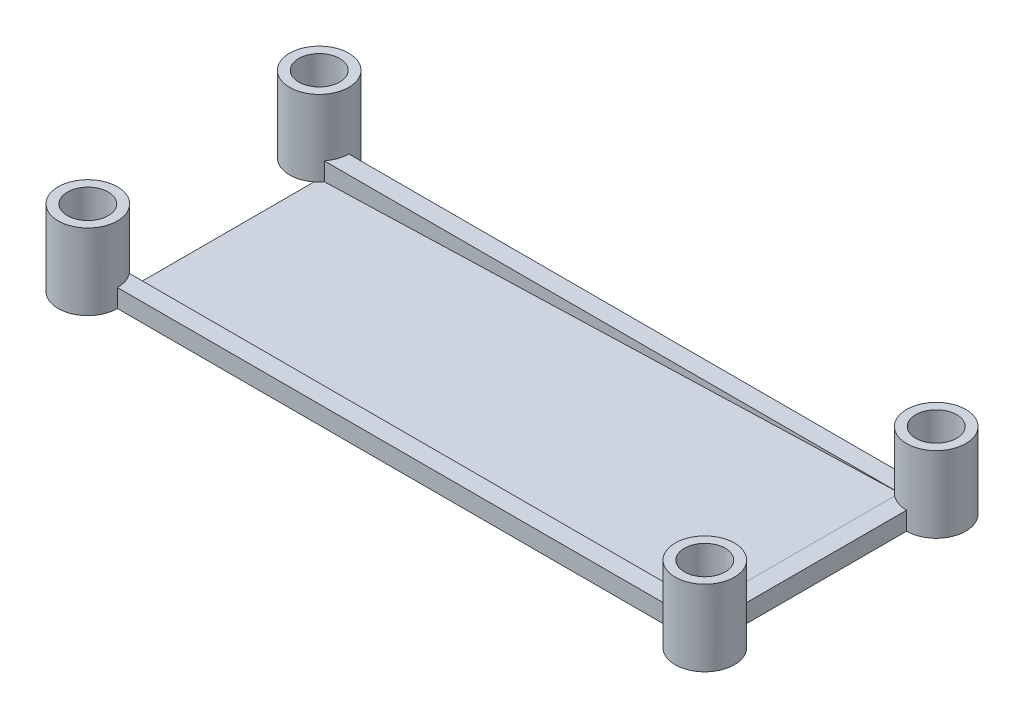
ISO-10303-21;
HEADER;
FILE_DESCRIPTION(('STEP AP214'),'2;1');
FILE_NAME('part.step','',(''),(''),'','','');
FILE_SCHEMA(('AUTOMOTIVE_DESIGN { 1 0 10303 214 1 1 1 1 }'));
ENDSEC;
DATA;
#1=APPLICATION_CONTEXT('core data for automotive mechanical design processes');
#2=APPLICATION_PROTOCOL_DEFINITION('international standard','automotive_design',2000,#1);
#3=PRODUCT_CONTEXT('',#1,'mechanical');
#4=PRODUCT('Part','Part','',(#3));
#5=PRODUCT_RELATED_PRODUCT_CATEGORY('part','',(#4));
#6=PRODUCT_DEFINITION_FORMATION('','',#4);
#7=PRODUCT_DEFINITION_CONTEXT('part definition',#1,'design');
#8=PRODUCT_DEFINITION('design','',#6,#7);
#9=PRODUCT_DEFINITION_SHAPE('','',#8);
#10=(LENGTH_UNIT() NAMED_UNIT(*) SI_UNIT(.MILLI.,.METRE.));
#11=(NAMED_UNIT(*) PLANE_ANGLE_UNIT() SI_UNIT($,.RADIAN.));
#12=(NAMED_UNIT(*) SI_UNIT($,.STERADIAN.) SOLID_ANGLE_UNIT());
#13=UNCERTAINTY_MEASURE_WITH_UNIT(LENGTH_MEASURE(1.E-05),#10,'distance_accuracy_value','');
#14=(GEOMETRIC_REPRESENTATION_CONTEXT(3) GLOBAL_UNCERTAINTY_ASSIGNED_CONTEXT((#13)) GLOBAL_UNIT_ASSIGNED_CONTEXT((#10,
#11,#12)) REPRESENTATION_CONTEXT('',''));
#15=CARTESIAN_POINT('',(0.,0.,0.));
#16=DIRECTION('',(0.,0.,1.));
#17=DIRECTION('',(1.,0.,0.));
#18=AXIS2_PLACEMENT_3D('',#15,#16,#17);
#19=CARTESIAN_POINT('',(0.,0.,0.));
#20=DIRECTION('',(0.,-1.,0.));
#21=DIRECTION('',(0.,0.,-1.));
#22=AXIS2_PLACEMENT_3D('',#19,#20,#21);
#23=PLANE('',#22);
#24=DIRECTION('',(-1.,0.,0.));
#25=VECTOR('',#24,1.);
#26=CARTESIAN_POINT('',(-203.2,0.,-76.2));
#27=LINE('',#26,#25);
#28=CARTESIAN_POINT('',(183.70625,0.,-76.2));
#29=VERTEX_POINT('',#28);
#30=CARTESIAN_POINT('',(-183.70625,0.,-76.2));
#31=VERTEX_POINT('',#30);
#32=EDGE_CURVE('E188',#29,#31,#27,.T.);
#33=ORIENTED_EDGE('',*,*,#32,.F.);
#34=CARTESIAN_POINT('',(203.2,0.,-76.2));
#35=DIRECTION('',(0.,1.,0.));
#36=DIRECTION('',(0.,0.,-1.));
#37=AXIS2_PLACEMENT_3D('',#34,#35,#36);
#38=CIRCLE('',#37,19.49375);
#39=CARTESIAN_POINT('',(203.2,0.,-56.7062499999999));
#40=VERTEX_POINT('',#39);
#41=EDGE_CURVE('E297',#40,#29,#38,.T.);
#42=ORIENTED_EDGE('',*,*,#41,.F.);
#43=DIRECTION('',(0.,0.,-1.));
#44=VECTOR('',#43,1.);
#45=CARTESIAN_POINT('',(203.2,0.,76.2));
#46=LINE('',#45,#44);
#47=CARTESIAN_POINT('',(203.2,0.,56.70625));
#48=VERTEX_POINT('',#47);
#49=EDGE_CURVE('E61',#48,#40,#46,.T.);
#50=ORIENTED_EDGE('',*,*,#49,.F.);
#51=CARTESIAN_POINT('',(203.2,0.,76.2));
#52=DIRECTION('',(0.,-1.,0.));
#53=DIRECTION('',(0.,0.,1.));
#54=AXIS2_PLACEMENT_3D('',#51,#52,#53);
#55=CIRCLE('',#54,19.49375);
#56=CARTESIAN_POINT('',(183.70625,0.,76.2));
#57=VERTEX_POINT('',#56);
#58=EDGE_CURVE('E280',#48,#57,#55,.T.);
#59=ORIENTED_EDGE('',*,*,#58,.T.);
#60=DIRECTION('',(1.,0.,0.));
#61=VECTOR('',#60,1.);
#62=CARTESIAN_POINT('',(-203.2,0.,76.2));
#63=LINE('',#62,#61);
#64=CARTESIAN_POINT('',(-183.70625,0.,76.2));
#65=VERTEX_POINT('',#64);
#66=EDGE_CURVE('E184',#65,#57,#63,.T.);
#67=ORIENTED_EDGE('',*,*,#66,.F.);
#68=CARTESIAN_POINT('',(-203.2,0.,76.2));
#69=DIRECTION('',(0.,1.,0.));
#70=DIRECTION('',(0.,0.,1.));
#71=AXIS2_PLACEMENT_3D('',#68,#69,#70);
#72=CIRCLE('',#71,19.49375);
#73=CARTESIAN_POINT('',(-191.2,0.,60.837503814077));
#74=VERTEX_POINT('',#73);
#75=EDGE_CURVE('E229',#74,#65,#72,.T.);
#76=ORIENTED_EDGE('',*,*,#75,.F.);
#77=DIRECTION('',(0.,0.,-1.));
#78=VECTOR('',#77,1.);
#79=CARTESIAN_POINT('',(-191.2,0.,76.202));
#80=LINE('',#79,#78);
#81=CARTESIAN_POINT('',(-191.2,0.,-60.837503814077));
#82=VERTEX_POINT('',#81);
#83=EDGE_CURVE('E210',#74,#82,#80,.T.);
#84=ORIENTED_EDGE('',*,*,#83,.T.);
#85=CARTESIAN_POINT('',(-203.2,0.,-76.2));
#86=DIRECTION('',(0.,-1.,0.));
#87=DIRECTION('',(0.,0.,-1.));
#88=AXIS2_PLACEMENT_3D('',#85,#86,#87);
#89=CIRCLE('',#88,19.49375);
#90=EDGE_CURVE('E253',#82,#31,#89,.T.);
#91=ORIENTED_EDGE('',*,*,#90,.T.);
#92=EDGE_LOOP('',(#33,#42,#50,#59,#67,#76,#84,#91));
#93=FACE_BOUND('',#92,.T.);
#94=ADVANCED_FACE('F45',(#93),#23,.T.);
#95=CARTESIAN_POINT('',(-191.2,0.,-64.2));
#96=DIRECTION('',(0.,0.,-1.));
#97=DIRECTION('',(-1.,0.,0.));
#98=AXIS2_PLACEMENT_3D('',#95,#96,#97);
#99=PLANE('',#98);
#100=DIRECTION('',(0.,-1.,0.));
#101=VECTOR('',#100,1.);
#102=CARTESIAN_POINT('',(187.837503814077,50.,-64.2));
#103=LINE('',#102,#101);
#104=CARTESIAN_POINT('',(187.837503814077,12.,-64.2));
#105=VERTEX_POINT('',#104);
#106=CARTESIAN_POINT('',(187.837503814077,11.8944823372618,-64.2));
#107=VERTEX_POINT('',#106);
#108=EDGE_CURVE('E166',#105,#107,#103,.T.);
#109=ORIENTED_EDGE('',*,*,#108,.F.);
#110=DIRECTION('',(-1.,0.,0.));
#111=VECTOR('',#110,1.);
#112=CARTESIAN_POINT('',(-191.2,12.,-64.2));
#113=LINE('',#112,#111);
#114=CARTESIAN_POINT('',(-187.837503814077,12.,-64.2));
#115=VERTEX_POINT('',#114);
#116=EDGE_CURVE('E147',#105,#115,#113,.T.);
#117=ORIENTED_EDGE('',*,*,#116,.T.);
#118=DIRECTION('',(0.,-1.,0.));
#119=VECTOR('',#118,1.);
#120=CARTESIAN_POINT('',(-187.837503814077,50.,-64.2));
#121=LINE('',#120,#119);
#122=CARTESIAN_POINT('',(-187.837503814077,0.105517662738171,-64.2));
#123=VERTEX_POINT('',#122);
#124=EDGE_CURVE('E248',#115,#123,#121,.T.);
#125=ORIENTED_EDGE('',*,*,#124,.T.);
#126=DIRECTION('',(-0.999507987519021,-0.0313653134158689,0.));
#127=VECTOR('',#126,1.);
#128=CARTESIAN_POINT('',(-191.2,0.,-64.2));
#129=LINE('',#128,#127);
#130=EDGE_CURVE('E206',#107,#123,#129,.T.);
#131=ORIENTED_EDGE('',*,*,#130,.F.);
#132=EDGE_LOOP('',(#109,#117,#125,#131));
#133=FACE_BOUND('',#132,.T.);
#134=ADVANCED_FACE('F334',(#133),#99,.F.);
#135=CARTESIAN_POINT('',(203.2,12.,76.2));
#136=DIRECTION('',(-1.,0.,0.));
#137=DIRECTION('',(0.,0.,1.));
#138=AXIS2_PLACEMENT_3D('',#135,#136,#137);
#139=PLANE('',#138);
#140=DIRECTION('',(0.,-1.,0.));
#141=VECTOR('',#140,1.);
#142=CARTESIAN_POINT('',(203.2,50.,-56.70625));
#143=LINE('',#142,#141);
#144=CARTESIAN_POINT('',(203.2,12.,-56.70625));
#145=VERTEX_POINT('',#144);
#146=EDGE_CURVE('E158',#145,#40,#143,.T.);
#147=ORIENTED_EDGE('',*,*,#146,.F.);
#148=DIRECTION('',(0.,0.,-1.));
#149=VECTOR('',#148,1.);
#150=CARTESIAN_POINT('',(203.2,12.,76.2));
#151=LINE('',#150,#149);
#152=CARTESIAN_POINT('',(203.2,12.,56.70625));
#153=VERTEX_POINT('',#152);
#154=EDGE_CURVE('E155',#153,#145,#151,.T.);
#155=ORIENTED_EDGE('',*,*,#154,.F.);
#156=DIRECTION('',(0.,-1.,0.));
#157=VECTOR('',#156,1.);
#158=CARTESIAN_POINT('',(203.2,50.,56.70625));
#159=LINE('',#158,#157);
#160=EDGE_CURVE('E273',#153,#48,#159,.T.);
#161=ORIENTED_EDGE('',*,*,#160,.T.);
#162=ORIENTED_EDGE('',*,*,#49,.T.);
#163=EDGE_LOOP('',(#147,#155,#161,#162));
#164=FACE_BOUND('',#163,.T.);
#165=ADVANCED_FACE('F47',(#164),#139,.F.);
#166=CARTESIAN_POINT('',(-203.2,12.,-76.2));
#167=DIRECTION('',(0.,0.,1.));
#168=DIRECTION('',(1.,0.,0.));
#169=AXIS2_PLACEMENT_3D('',#166,#167,#168);
#170=PLANE('',#169);
#171=DIRECTION('',(0.,-1.,0.));
#172=VECTOR('',#171,1.);
#173=CARTESIAN_POINT('',(183.70625,50.,-76.2));
#174=LINE('',#173,#172);
#175=CARTESIAN_POINT('',(183.70625,12.,-76.2));
#176=VERTEX_POINT('',#175);
#177=EDGE_CURVE('E69',#29,#176,#174,.F.);
#178=ORIENTED_EDGE('',*,*,#177,.F.);
#179=ORIENTED_EDGE('',*,*,#32,.T.);
#180=DIRECTION('',(0.,-1.,0.));
#181=VECTOR('',#180,1.);
#182=CARTESIAN_POINT('',(-183.70625,50.,-76.2));
#183=LINE('',#182,#181);
#184=CARTESIAN_POINT('',(-183.70625,12.,-76.2));
#185=VERTEX_POINT('',#184);
#186=EDGE_CURVE('E240',#31,#185,#183,.F.);
#187=ORIENTED_EDGE('',*,*,#186,.T.);
#188=DIRECTION('',(-1.,0.,0.));
#189=VECTOR('',#188,1.);
#190=CARTESIAN_POINT('',(-203.2,12.,-76.2));
#191=LINE('',#190,#189);
#192=EDGE_CURVE('E196',#176,#185,#191,.T.);
#193=ORIENTED_EDGE('',*,*,#192,.F.);
#194=EDGE_LOOP('',(#178,#179,#187,#193));
#195=FACE_BOUND('',#194,.T.);
#196=ADVANCED_FACE('F350',(#195),#170,.F.);
#197=CARTESIAN_POINT('',(0.,12.,0.));
#198=DIRECTION('',(0.,-1.,0.));
#199=DIRECTION('',(0.,0.,-1.));
#200=AXIS2_PLACEMENT_3D('',#197,#198,#199);
#201=PLANE('',#200);
#202=CARTESIAN_POINT('',(203.2,12.,-76.2));
#203=DIRECTION('',(0.,-1.,0.));
#204=DIRECTION('',(0.,0.,-1.));
#205=AXIS2_PLACEMENT_3D('',#202,#203,#204);
#206=CIRCLE('',#205,19.49375);
#207=EDGE_CURVE('E161',#176,#105,#206,.F.);
#208=ORIENTED_EDGE('',*,*,#207,.F.);
#209=ORIENTED_EDGE('',*,*,#192,.T.);
#210=CARTESIAN_POINT('',(-203.2,12.,-76.2));
#211=DIRECTION('',(0.,-1.,0.));
#212=DIRECTION('',(0.,0.,-1.));
#213=AXIS2_PLACEMENT_3D('',#210,#211,#212);
#214=CIRCLE('',#213,19.49375);
#215=EDGE_CURVE('E244',#185,#115,#214,.T.);
#216=ORIENTED_EDGE('',*,*,#215,.T.);
#217=ORIENTED_EDGE('',*,*,#116,.F.);
#218=EDGE_LOOP('',(#208,#209,#216,#217));
#219=FACE_BOUND('',#218,.T.);
#220=ADVANCED_FACE('F352',(#219),#201,.F.);
#221=DIRECTION('',(1.,0.,0.));
#222=VECTOR('',#221,1.);
#223=CARTESIAN_POINT('',(-203.2,12.,76.2));
#224=LINE('',#223,#222);
#225=CARTESIAN_POINT('',(-183.70625,12.,76.2));
#226=VERTEX_POINT('',#225);
#227=CARTESIAN_POINT('',(183.70625,12.,76.2));
#228=VERTEX_POINT('',#227);
#229=EDGE_CURVE('E183',#226,#228,#224,.T.);
#230=ORIENTED_EDGE('',*,*,#229,.T.);
#231=CARTESIAN_POINT('',(203.2,12.,76.2));
#232=DIRECTION('',(0.,-1.,0.));
#233=DIRECTION('',(0.,0.,-1.));
#234=AXIS2_PLACEMENT_3D('',#231,#232,#233);
#235=CIRCLE('',#234,19.49375);
#236=CARTESIAN_POINT('',(187.837503814077,12.,64.2));
#237=VERTEX_POINT('',#236);
#238=EDGE_CURVE('E268',#228,#237,#235,.T.);
#239=ORIENTED_EDGE('',*,*,#238,.T.);
#240=DIRECTION('',(1.,0.,0.));
#241=VECTOR('',#240,1.);
#242=CARTESIAN_POINT('',(-191.2,12.,64.2));
#243=LINE('',#242,#241);
#244=CARTESIAN_POINT('',(-187.837503814077,12.,64.2));
#245=VERTEX_POINT('',#244);
#246=EDGE_CURVE('E148',#245,#237,#243,.T.);
#247=ORIENTED_EDGE('',*,*,#246,.F.);
#248=CARTESIAN_POINT('',(-203.2,12.,76.2));
#249=DIRECTION('',(0.,-1.,0.));
#250=DIRECTION('',(0.,0.,-1.));
#251=AXIS2_PLACEMENT_3D('',#248,#249,#250);
#252=CIRCLE('',#251,19.49375);
#253=EDGE_CURVE('E220',#226,#245,#252,.F.);
#254=ORIENTED_EDGE('',*,*,#253,.F.);
#255=EDGE_LOOP('',(#230,#239,#247,#254));
#256=FACE_BOUND('',#255,.T.);
#257=ADVANCED_FACE('F357',(#256),#201,.F.);
#258=CARTESIAN_POINT('',(-191.2,0.,64.2));
#259=DIRECTION('',(0.,0.,1.));
#260=DIRECTION('',(1.,0.,0.));
#261=AXIS2_PLACEMENT_3D('',#258,#259,#260);
#262=PLANE('',#261);
#263=ORIENTED_EDGE('',*,*,#246,.T.);
#264=DIRECTION('',(0.,-1.,0.));
#265=VECTOR('',#264,1.);
#266=CARTESIAN_POINT('',(187.837503814077,50.,64.2));
#267=LINE('',#266,#265);
#268=CARTESIAN_POINT('',(187.837503814077,11.8944823372618,64.2));
#269=VERTEX_POINT('',#268);
#270=EDGE_CURVE('E269',#237,#269,#267,.T.);
#271=ORIENTED_EDGE('',*,*,#270,.T.);
#272=DIRECTION('',(-0.999507987519021,-0.0313653134158689,0.));
#273=VECTOR('',#272,1.);
#274=CARTESIAN_POINT('',(-191.2,0.,64.2));
#275=LINE('',#274,#273);
#276=CARTESIAN_POINT('',(-187.837503814077,0.105517662738171,64.2));
#277=VERTEX_POINT('',#276);
#278=EDGE_CURVE('E207',#269,#277,#275,.T.);
#279=ORIENTED_EDGE('',*,*,#278,.T.);
#280=DIRECTION('',(0.,-1.,0.));
#281=VECTOR('',#280,1.);
#282=CARTESIAN_POINT('',(-187.837503814077,50.,64.2));
#283=LINE('',#282,#281);
#284=EDGE_CURVE('E224',#245,#277,#283,.T.);
#285=ORIENTED_EDGE('',*,*,#284,.F.);
#286=EDGE_LOOP('',(#263,#271,#279,#285));
#287=FACE_BOUND('',#286,.T.);
#288=ADVANCED_FACE('F348',(#287),#262,.F.);
#289=CARTESIAN_POINT('',(-203.2,12.,76.2));
#290=DIRECTION('',(0.,0.,-1.));
#291=DIRECTION('',(-1.,0.,0.));
#292=AXIS2_PLACEMENT_3D('',#289,#290,#291);
#293=PLANE('',#292);
#294=ORIENTED_EDGE('',*,*,#66,.T.);
#295=DIRECTION('',(0.,-1.,0.));
#296=VECTOR('',#295,1.);
#297=CARTESIAN_POINT('',(183.70625,50.,76.2));
#298=LINE('',#297,#296);
#299=EDGE_CURVE('E264',#57,#228,#298,.F.);
#300=ORIENTED_EDGE('',*,*,#299,.T.);
#301=ORIENTED_EDGE('',*,*,#229,.F.);
#302=DIRECTION('',(0.,-1.,0.));
#303=VECTOR('',#302,1.);
#304=CARTESIAN_POINT('',(-183.70625,50.,76.2));
#305=LINE('',#304,#303);
#306=EDGE_CURVE('E211',#65,#226,#305,.F.);
#307=ORIENTED_EDGE('',*,*,#306,.F.);
#308=EDGE_LOOP('',(#294,#300,#301,#307));
#309=FACE_BOUND('',#308,.T.);
#310=ADVANCED_FACE('F346',(#309),#293,.F.);
#311=CARTESIAN_POINT('',(191.2,12.,-60.837503814077));
#312=VERTEX_POINT('',#311);
#313=EDGE_CURVE('E152',#312,#145,#206,.F.);
#314=ORIENTED_EDGE('',*,*,#313,.F.);
#315=DIRECTION('',(0.,0.,-1.));
#316=VECTOR('',#315,1.);
#317=CARTESIAN_POINT('',(191.2,12.,64.2));
#318=LINE('',#317,#316);
#319=CARTESIAN_POINT('',(191.2,12.,60.837503814077));
#320=VERTEX_POINT('',#319);
#321=EDGE_CURVE('E137',#320,#312,#318,.T.);
#322=ORIENTED_EDGE('',*,*,#321,.F.);
#323=EDGE_CURVE('E276',#320,#153,#235,.T.);
#324=ORIENTED_EDGE('',*,*,#323,.T.);
#325=ORIENTED_EDGE('',*,*,#154,.T.);
#326=EDGE_LOOP('',(#314,#322,#324,#325));
#327=FACE_BOUND('',#326,.T.);
#328=ADVANCED_FACE('F153',(#327),#201,.F.);
#329=CARTESIAN_POINT('',(-191.2,0.,76.202));
#330=DIRECTION('',(0.0313653134158689,-0.999507987519021,0.));
#331=DIRECTION('',(0.999507987519021,0.0313653134158689,0.));
#332=AXIS2_PLACEMENT_3D('',#329,#330,#331);
#333=PLANE('',#332);
#334=CARTESIAN_POINT('',(203.2,12.3765690376569,-76.2));
#335=DIRECTION('',(0.0313653134158689,-0.999507987519021,0.));
#336=DIRECTION('',(-0.999507987519021,-0.0313653134158689,0.));
#337=AXIS2_PLACEMENT_3D('',#334,#335,#336);
#338=ELLIPSE('',#337,19.5033458895985,19.49375);
#339=EDGE_CURVE('E54',#107,#312,#338,.F.);
#340=ORIENTED_EDGE('',*,*,#339,.F.);
#341=ORIENTED_EDGE('',*,*,#130,.T.);
#342=CARTESIAN_POINT('',(-203.2,-0.376569037656906,-76.2));
#343=DIRECTION('',(0.0313653134158689,-0.999507987519021,0.));
#344=DIRECTION('',(-0.999507987519021,-0.0313653134158689,0.));
#345=AXIS2_PLACEMENT_3D('',#342,#343,#344);
#346=ELLIPSE('',#345,19.5033458895985,19.49375);
#347=EDGE_CURVE('E169',#123,#82,#346,.T.);
#348=ORIENTED_EDGE('',*,*,#347,.T.);
#349=ORIENTED_EDGE('',*,*,#83,.F.);
#350=CARTESIAN_POINT('',(-203.2,-0.376569037656906,76.2));
#351=DIRECTION('',(0.0313653134158689,-0.999507987519021,0.));
#352=DIRECTION('',(-0.999507987519021,-0.0313653134158689,0.));
#353=AXIS2_PLACEMENT_3D('',#350,#351,#352);
#354=ELLIPSE('',#353,19.5033458895985,19.49375);
#355=EDGE_CURVE('E179',#277,#74,#354,.F.);
#356=ORIENTED_EDGE('',*,*,#355,.F.);
#357=ORIENTED_EDGE('',*,*,#278,.F.);
#358=CARTESIAN_POINT('',(203.2,12.3765690376569,76.2));
#359=DIRECTION('',(0.0313653134158689,-0.999507987519021,0.));
#360=DIRECTION('',(-0.999507987519021,-0.0313653134158689,0.));
#361=AXIS2_PLACEMENT_3D('',#358,#359,#360);
#362=ELLIPSE('',#361,19.5033458895985,19.49375);
#363=EDGE_CURVE('E143',#269,#320,#362,.T.);
#364=ORIENTED_EDGE('',*,*,#363,.T.);
#365=ORIENTED_EDGE('',*,*,#321,.T.);
#366=EDGE_LOOP('',(#340,#341,#348,#349,#356,#357,#364,#365));
#367=FACE_BOUND('',#366,.T.);
#368=ADVANCED_FACE('F139',(#367),#333,.F.);
#369=CARTESIAN_POINT('',(-203.2,50.,76.2));
#370=DIRECTION('',(0.,-1.,0.));
#371=DIRECTION('',(0.,0.,-1.));
#372=AXIS2_PLACEMENT_3D('',#369,#370,#371);
#373=CYLINDRICAL_SURFACE('',#372,13.49375);
#374=CARTESIAN_POINT('',(-203.2,12.,76.2));
#375=DIRECTION('',(0.,1.,0.));
#376=DIRECTION('',(0.,0.,1.));
#377=AXIS2_PLACEMENT_3D('',#374,#375,#376);
#378=CIRCLE('',#377,13.49375);
#379=CARTESIAN_POINT('',(-203.2,12.,89.69375));
#380=VERTEX_POINT('',#379);
#381=EDGE_CURVE('E175',#380,#380,#378,.T.);
#382=ORIENTED_EDGE('',*,*,#381,.F.);
#383=EDGE_LOOP('',(#382));
#384=FACE_BOUND('',#383,.T.);
#385=CARTESIAN_POINT('',(-203.2,50.,76.2));
#386=DIRECTION('',(0.,1.,0.));
#387=DIRECTION('',(0.,0.,1.));
#388=AXIS2_PLACEMENT_3D('',#385,#386,#387);
#389=CIRCLE('',#388,13.49375);
#390=CARTESIAN_POINT('',(-203.2,50.,89.69375));
#391=VERTEX_POINT('',#390);
#392=EDGE_CURVE('E233',#391,#391,#389,.T.);
#393=ORIENTED_EDGE('',*,*,#392,.T.);
#394=EDGE_LOOP('',(#393));
#395=FACE_BOUND('',#394,.T.);
#396=ADVANCED_FACE('F411',(#384,#395),#373,.F.);
#397=CARTESIAN_POINT('',(-203.2,50.,76.2));
#398=DIRECTION('',(0.,-1.,0.));
#399=DIRECTION('',(0.,0.,-1.));
#400=AXIS2_PLACEMENT_3D('',#397,#398,#399);
#401=CYLINDRICAL_SURFACE('',#400,19.49375);
#402=CARTESIAN_POINT('',(-203.2,50.,76.2));
#403=DIRECTION('',(0.,1.,0.));
#404=DIRECTION('',(0.,0.,1.));
#405=AXIS2_PLACEMENT_3D('',#402,#403,#404);
#406=CIRCLE('',#405,19.49375);
#407=CARTESIAN_POINT('',(-203.2,50.,95.69375));
#408=VERTEX_POINT('',#407);
#409=EDGE_CURVE('E228',#408,#408,#406,.T.);
#410=ORIENTED_EDGE('',*,*,#409,.F.);
#411=EDGE_LOOP('',(#410));
#412=FACE_BOUND('',#411,.T.);
#413=ORIENTED_EDGE('',*,*,#75,.T.);
#414=ORIENTED_EDGE('',*,*,#306,.T.);
#415=ORIENTED_EDGE('',*,*,#253,.T.);
#416=ORIENTED_EDGE('',*,*,#284,.T.);
#417=ORIENTED_EDGE('',*,*,#355,.T.);
#418=EDGE_LOOP('',(#413,#414,#415,#416,#417));
#419=FACE_BOUND('',#418,.T.);
#420=ADVANCED_FACE('F379',(#412,#419),#401,.T.);
#421=CARTESIAN_POINT('',(-203.2,50.,76.2));
#422=DIRECTION('',(0.,1.,0.));
#423=DIRECTION('',(0.,0.,1.));
#424=AXIS2_PLACEMENT_3D('',#421,#422,#423);
#425=PLANE('',#424);
#426=ORIENTED_EDGE('',*,*,#409,.T.);
#427=EDGE_LOOP('',(#426));
#428=FACE_BOUND('',#427,.T.);
#429=ORIENTED_EDGE('',*,*,#392,.F.);
#430=EDGE_LOOP('',(#429));
#431=FACE_BOUND('',#430,.T.);
#432=ADVANCED_FACE('F409',(#428,#431),#425,.T.);
#433=CARTESIAN_POINT('',(-203.2,12.,76.2));
#434=DIRECTION('',(0.,1.,0.));
#435=DIRECTION('',(0.,0.,1.));
#436=AXIS2_PLACEMENT_3D('',#433,#434,#435);
#437=PLANE('',#436);
#438=ORIENTED_EDGE('',*,*,#381,.T.);
#439=EDGE_LOOP('',(#438));
#440=FACE_BOUND('',#439,.T.);
#441=ADVANCED_FACE('F400',(#440),#437,.T.);
#442=CARTESIAN_POINT('',(-203.2,50.,-76.2));
#443=DIRECTION('',(0.,-1.,0.));
#444=DIRECTION('',(0.,0.,-1.));
#445=AXIS2_PLACEMENT_3D('',#442,#443,#444);
#446=CYLINDRICAL_SURFACE('',#445,13.49375);
#447=CARTESIAN_POINT('',(-203.2,12.,-76.2));
#448=DIRECTION('',(0.,-1.,0.));
#449=DIRECTION('',(0.,0.,-1.));
#450=AXIS2_PLACEMENT_3D('',#447,#448,#449);
#451=CIRCLE('',#450,13.49375);
#452=CARTESIAN_POINT('',(-203.2,12.,-89.69375));
#453=VERTEX_POINT('',#452);
#454=EDGE_CURVE('E307',#453,#453,#451,.T.);
#455=ORIENTED_EDGE('',*,*,#454,.T.);
#456=EDGE_LOOP('',(#455));
#457=FACE_BOUND('',#456,.T.);
#458=CARTESIAN_POINT('',(-203.2,50.,-76.2));
#459=DIRECTION('',(0.,-1.,0.));
#460=DIRECTION('',(0.,0.,-1.));
#461=AXIS2_PLACEMENT_3D('',#458,#459,#460);
#462=CIRCLE('',#461,13.49375);
#463=CARTESIAN_POINT('',(-203.2,50.,-89.69375));
#464=VERTEX_POINT('',#463);
#465=EDGE_CURVE('E257',#464,#464,#462,.T.);
#466=ORIENTED_EDGE('',*,*,#465,.F.);
#467=EDGE_LOOP('',(#466));
#468=FACE_BOUND('',#467,.T.);
#469=ADVANCED_FACE('F397',(#457,#468),#446,.F.);
#470=CARTESIAN_POINT('',(-203.2,50.,-76.2));
#471=DIRECTION('',(0.,-1.,0.));
#472=DIRECTION('',(0.,0.,-1.));
#473=AXIS2_PLACEMENT_3D('',#470,#471,#472);
#474=CYLINDRICAL_SURFACE('',#473,19.49375);
#475=CARTESIAN_POINT('',(-203.2,50.,-76.2));
#476=DIRECTION('',(0.,-1.,0.));
#477=DIRECTION('',(0.,0.,-1.));
#478=AXIS2_PLACEMENT_3D('',#475,#476,#477);
#479=CIRCLE('',#478,19.49375);
#480=CARTESIAN_POINT('',(-203.2,50.,-95.69375));
#481=VERTEX_POINT('',#480);
#482=EDGE_CURVE('E252',#481,#481,#479,.T.);
#483=ORIENTED_EDGE('',*,*,#482,.T.);
#484=EDGE_LOOP('',(#483));
#485=FACE_BOUND('',#484,.T.);
#486=ORIENTED_EDGE('',*,*,#186,.F.);
#487=ORIENTED_EDGE('',*,*,#90,.F.);
#488=ORIENTED_EDGE('',*,*,#347,.F.);
#489=ORIENTED_EDGE('',*,*,#124,.F.);
#490=ORIENTED_EDGE('',*,*,#215,.F.);
#491=EDGE_LOOP('',(#486,#487,#488,#489,#490));
#492=FACE_BOUND('',#491,.T.);
#493=ADVANCED_FACE('F365',(#485,#492),#474,.T.);
#494=CARTESIAN_POINT('',(-203.2,50.,-76.2));
#495=DIRECTION('',(0.,1.,0.));
#496=DIRECTION('',(0.,0.,-1.));
#497=AXIS2_PLACEMENT_3D('',#494,#495,#496);
#498=PLANE('',#497);
#499=ORIENTED_EDGE('',*,*,#465,.T.);
#500=EDGE_LOOP('',(#499));
#501=FACE_BOUND('',#500,.T.);
#502=ORIENTED_EDGE('',*,*,#482,.F.);
#503=EDGE_LOOP('',(#502));
#504=FACE_BOUND('',#503,.T.);
#505=ADVANCED_FACE('F394',(#501,#504),#498,.T.);
#506=CARTESIAN_POINT('',(203.2,50.,76.2));
#507=DIRECTION('',(0.,-1.,0.));
#508=DIRECTION('',(0.,0.,-1.));
#509=AXIS2_PLACEMENT_3D('',#506,#507,#508);
#510=CYLINDRICAL_SURFACE('',#509,13.49375);
#511=CARTESIAN_POINT('',(203.2,12.,76.2));
#512=DIRECTION('',(0.,-1.,0.));
#513=DIRECTION('',(0.,0.,1.));
#514=AXIS2_PLACEMENT_3D('',#511,#512,#513);
#515=CIRCLE('',#514,13.49375);
#516=CARTESIAN_POINT('',(203.2,12.,89.69375));
#517=VERTEX_POINT('',#516);
#518=EDGE_CURVE('E311',#517,#517,#515,.T.);
#519=ORIENTED_EDGE('',*,*,#518,.T.);
#520=EDGE_LOOP('',(#519));
#521=FACE_BOUND('',#520,.T.);
#522=CARTESIAN_POINT('',(203.2,50.,76.2));
#523=DIRECTION('',(0.,-1.,0.));
#524=DIRECTION('',(0.,0.,1.));
#525=AXIS2_PLACEMENT_3D('',#522,#523,#524);
#526=CIRCLE('',#525,13.49375);
#527=CARTESIAN_POINT('',(203.2,50.,89.69375));
#528=VERTEX_POINT('',#527);
#529=EDGE_CURVE('E284',#528,#528,#526,.T.);
#530=ORIENTED_EDGE('',*,*,#529,.F.);
#531=EDGE_LOOP('',(#530));
#532=FACE_BOUND('',#531,.T.);
#533=ADVANCED_FACE('F316',(#521,#532),#510,.F.);
#534=CARTESIAN_POINT('',(203.2,50.,76.2));
#535=DIRECTION('',(0.,-1.,0.));
#536=DIRECTION('',(0.,0.,-1.));
#537=AXIS2_PLACEMENT_3D('',#534,#535,#536);
#538=CYLINDRICAL_SURFACE('',#537,19.49375);
#539=CARTESIAN_POINT('',(203.2,50.,76.2));
#540=DIRECTION('',(0.,-1.,0.));
#541=DIRECTION('',(0.,0.,1.));
#542=AXIS2_PLACEMENT_3D('',#539,#540,#541);
#543=CIRCLE('',#542,19.49375);
#544=CARTESIAN_POINT('',(203.2,50.,95.69375));
#545=VERTEX_POINT('',#544);
#546=EDGE_CURVE('E279',#545,#545,#543,.T.);
#547=ORIENTED_EDGE('',*,*,#546,.T.);
#548=EDGE_LOOP('',(#547));
#549=FACE_BOUND('',#548,.T.);
#550=ORIENTED_EDGE('',*,*,#299,.F.);
#551=ORIENTED_EDGE('',*,*,#58,.F.);
#552=ORIENTED_EDGE('',*,*,#160,.F.);
#553=ORIENTED_EDGE('',*,*,#323,.F.);
#554=ORIENTED_EDGE('',*,*,#363,.F.);
#555=ORIENTED_EDGE('',*,*,#270,.F.);
#556=ORIENTED_EDGE('',*,*,#238,.F.);
#557=EDGE_LOOP('',(#550,#551,#552,#553,#554,#555,#556));
#558=FACE_BOUND('',#557,.T.);
#559=ADVANCED_FACE('F382',(#549,#558),#538,.T.);
#560=CARTESIAN_POINT('',(203.2,50.,76.2));
#561=DIRECTION('',(0.,1.,0.));
#562=DIRECTION('',(0.,0.,1.));
#563=AXIS2_PLACEMENT_3D('',#560,#561,#562);
#564=PLANE('',#563);
#565=ORIENTED_EDGE('',*,*,#529,.T.);
#566=EDGE_LOOP('',(#565));
#567=FACE_BOUND('',#566,.T.);
#568=ORIENTED_EDGE('',*,*,#546,.F.);
#569=EDGE_LOOP('',(#568));
#570=FACE_BOUND('',#569,.T.);
#571=ADVANCED_FACE('F384',(#567,#570),#564,.T.);
#572=CARTESIAN_POINT('',(203.2,50.,-76.2));
#573=DIRECTION('',(0.,-1.,0.));
#574=DIRECTION('',(0.,0.,-1.));
#575=AXIS2_PLACEMENT_3D('',#572,#573,#574);
#576=CYLINDRICAL_SURFACE('',#575,13.49375);
#577=CARTESIAN_POINT('',(203.2,12.,-76.2));
#578=DIRECTION('',(0.,1.,0.));
#579=DIRECTION('',(0.,0.,1.));
#580=AXIS2_PLACEMENT_3D('',#577,#578,#579);
#581=CIRCLE('',#580,13.49375);
#582=CARTESIAN_POINT('',(203.2,12.,-62.70625));
#583=VERTEX_POINT('',#582);
#584=EDGE_CURVE('E11',#583,#583,#581,.T.);
#585=ORIENTED_EDGE('',*,*,#584,.F.);
#586=EDGE_LOOP('',(#585));
#587=FACE_BOUND('',#586,.T.);
#588=CARTESIAN_POINT('',(203.2,50.,-76.2));
#589=DIRECTION('',(0.,1.,0.));
#590=DIRECTION('',(0.,0.,-1.));
#591=AXIS2_PLACEMENT_3D('',#588,#589,#590);
#592=CIRCLE('',#591,13.49375);
#593=CARTESIAN_POINT('',(203.2,50.,-89.69375));
#594=VERTEX_POINT('',#593);
#595=EDGE_CURVE('E300',#594,#594,#592,.T.);
#596=ORIENTED_EDGE('',*,*,#595,.T.);
#597=EDGE_LOOP('',(#596));
#598=FACE_BOUND('',#597,.T.);
#599=ADVANCED_FACE('F391',(#587,#598),#576,.F.);
#600=CARTESIAN_POINT('',(203.2,50.,-76.2));
#601=DIRECTION('',(0.,-1.,0.));
#602=DIRECTION('',(0.,0.,-1.));
#603=AXIS2_PLACEMENT_3D('',#600,#601,#602);
#604=CYLINDRICAL_SURFACE('',#603,19.49375);
#605=CARTESIAN_POINT('',(203.2,50.,-76.2));
#606=DIRECTION('',(0.,1.,0.));
#607=DIRECTION('',(0.,0.,-1.));
#608=AXIS2_PLACEMENT_3D('',#605,#606,#607);
#609=CIRCLE('',#608,19.49375);
#610=CARTESIAN_POINT('',(203.2,50.,-95.69375));
#611=VERTEX_POINT('',#610);
#612=EDGE_CURVE('E159',#611,#611,#609,.T.);
#613=ORIENTED_EDGE('',*,*,#612,.F.);
#614=EDGE_LOOP('',(#613));
#615=FACE_BOUND('',#614,.T.);
#616=ORIENTED_EDGE('',*,*,#41,.T.);
#617=ORIENTED_EDGE('',*,*,#177,.T.);
#618=ORIENTED_EDGE('',*,*,#207,.T.);
#619=ORIENTED_EDGE('',*,*,#108,.T.);
#620=ORIENTED_EDGE('',*,*,#339,.T.);
#621=ORIENTED_EDGE('',*,*,#313,.T.);
#622=ORIENTED_EDGE('',*,*,#146,.T.);
#623=EDGE_LOOP('',(#616,#617,#618,#619,#620,#621,#622));
#624=FACE_BOUND('',#623,.T.);
#625=ADVANCED_FACE('F164',(#615,#624),#604,.T.);
#626=CARTESIAN_POINT('',(203.2,50.,-76.2));
#627=DIRECTION('',(0.,1.,0.));
#628=DIRECTION('',(0.,0.,-1.));
#629=AXIS2_PLACEMENT_3D('',#626,#627,#628);
#630=PLANE('',#629);
#631=ORIENTED_EDGE('',*,*,#612,.T.);
#632=EDGE_LOOP('',(#631));
#633=FACE_BOUND('',#632,.T.);
#634=ORIENTED_EDGE('',*,*,#595,.F.);
#635=EDGE_LOOP('',(#634));
#636=FACE_BOUND('',#635,.T.);
#637=ADVANCED_FACE('F330',(#633,#636),#630,.T.);
#638=CARTESIAN_POINT('',(-203.2,12.,-76.2));
#639=DIRECTION('',(0.,1.,0.));
#640=DIRECTION('',(0.,0.,-1.));
#641=AXIS2_PLACEMENT_3D('',#638,#639,#640);
#642=PLANE('',#641);
#643=ORIENTED_EDGE('',*,*,#454,.F.);
#644=EDGE_LOOP('',(#643));
#645=FACE_BOUND('',#644,.T.);
#646=ADVANCED_FACE('F322',(#645),#642,.T.);
#647=CARTESIAN_POINT('',(203.2,12.,76.2));
#648=DIRECTION('',(0.,1.,0.));
#649=DIRECTION('',(0.,0.,1.));
#650=AXIS2_PLACEMENT_3D('',#647,#648,#649);
#651=PLANE('',#650);
#652=ORIENTED_EDGE('',*,*,#518,.F.);
#653=EDGE_LOOP('',(#652));
#654=FACE_BOUND('',#653,.T.);
#655=ADVANCED_FACE('F319',(#654),#651,.T.);
#656=CARTESIAN_POINT('',(203.2,12.,-76.2));
#657=DIRECTION('',(0.,1.,0.));
#658=DIRECTION('',(0.,0.,-1.));
#659=AXIS2_PLACEMENT_3D('',#656,#657,#658);
#660=PLANE('',#659);
#661=ORIENTED_EDGE('',*,*,#584,.T.);
#662=EDGE_LOOP('',(#661));
#663=FACE_BOUND('',#662,.T.);
#664=ADVANCED_FACE('F321',(#663),#660,.T.);
#665=CLOSED_SHELL('',(#94,#134,#165,#196,#220,#257,#288,#310,#328,#368,#396,#420,#432,#441,#469,
#493,#505,#533,#559,#571,#599,#625,#637,#646,#655,#664));
#666=MANIFOLD_SOLID_BREP('B2',#665);
#667=ADVANCED_BREP_SHAPE_REPRESENTATION('',(#18,#666),#14);
#668=SHAPE_DEFINITION_REPRESENTATION(#9,#667);
ENDSEC;
END-ISO-10303-21;
